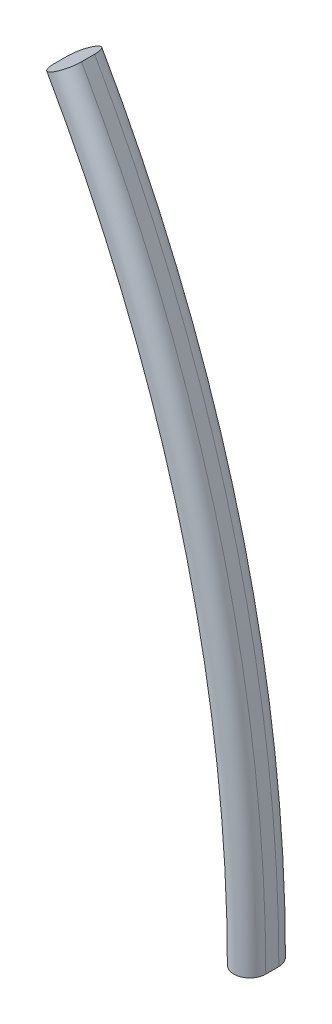
ISO-10303-21;
HEADER;
FILE_DESCRIPTION(('STEP AP214'),'2;1');
FILE_NAME('part.step','',(''),(''),'','','');
FILE_SCHEMA(('AUTOMOTIVE_DESIGN { 1 0 10303 214 1 1 1 1 }'));
ENDSEC;
DATA;
#1=APPLICATION_CONTEXT('core data for automotive mechanical design processes');
#2=APPLICATION_PROTOCOL_DEFINITION('international standard','automotive_design',2000,#1);
#3=PRODUCT_CONTEXT('',#1,'mechanical');
#4=PRODUCT('Part','Part','',(#3));
#5=PRODUCT_RELATED_PRODUCT_CATEGORY('part','',(#4));
#6=PRODUCT_DEFINITION_FORMATION('','',#4);
#7=PRODUCT_DEFINITION_CONTEXT('part definition',#1,'design');
#8=PRODUCT_DEFINITION('design','',#6,#7);
#9=PRODUCT_DEFINITION_SHAPE('','',#8);
#10=(LENGTH_UNIT() NAMED_UNIT(*) SI_UNIT(.MILLI.,.METRE.));
#11=(NAMED_UNIT(*) PLANE_ANGLE_UNIT() SI_UNIT($,.RADIAN.));
#12=(NAMED_UNIT(*) SI_UNIT($,.STERADIAN.) SOLID_ANGLE_UNIT());
#13=UNCERTAINTY_MEASURE_WITH_UNIT(LENGTH_MEASURE(1.E-05),#10,'distance_accuracy_value','');
#14=(GEOMETRIC_REPRESENTATION_CONTEXT(3) GLOBAL_UNCERTAINTY_ASSIGNED_CONTEXT((#13)) GLOBAL_UNIT_ASSIGNED_CONTEXT((#10,
#11,#12)) REPRESENTATION_CONTEXT('',''));
#15=CARTESIAN_POINT('',(0.,0.,0.));
#16=DIRECTION('',(0.,0.,1.));
#17=DIRECTION('',(1.,0.,0.));
#18=AXIS2_PLACEMENT_3D('',#15,#16,#17);
#19=CARTESIAN_POINT('',(0.,0.,2.1));
#20=DIRECTION('',(0.,1.,0.));
#21=DIRECTION('',(0.,0.,1.));
#22=AXIS2_PLACEMENT_3D('',#19,#20,#21);
#23=PLANE('',#22);
#24=DIRECTION('',(0.,0.,1.));
#25=VECTOR('',#24,1.);
#26=CARTESIAN_POINT('',(-4.72499999999998,0.,-2.1));
#27=LINE('',#26,#25);
#28=CARTESIAN_POINT('',(-4.72499999999998,0.,-2.1));
#29=VERTEX_POINT('',#28);
#30=CARTESIAN_POINT('',(-4.72499999999998,0.,2.1));
#31=VERTEX_POINT('',#30);
#32=EDGE_CURVE('E127',#29,#31,#27,.T.);
#33=ORIENTED_EDGE('',*,*,#32,.T.);
#34=CARTESIAN_POINT('',(0.,0.,2.1));
#35=DIRECTION('',(0.,1.,0.));
#36=DIRECTION('',(0.,0.,1.));
#37=AXIS2_PLACEMENT_3D('',#34,#35,#36);
#38=CIRCLE('',#37,4.725);
#39=CARTESIAN_POINT('',(4.72499999999998,0.,2.1));
#40=VERTEX_POINT('',#39);
#41=EDGE_CURVE('E130',#31,#40,#38,.T.);
#42=ORIENTED_EDGE('',*,*,#41,.T.);
#43=DIRECTION('',(0.,0.,1.));
#44=VECTOR('',#43,1.);
#45=CARTESIAN_POINT('',(4.72499999999998,0.,2.1));
#46=LINE('',#45,#44);
#47=CARTESIAN_POINT('',(4.72499999999998,0.,-2.1));
#48=VERTEX_POINT('',#47);
#49=EDGE_CURVE('E120',#40,#48,#46,.F.);
#50=ORIENTED_EDGE('',*,*,#49,.T.);
#51=CARTESIAN_POINT('',(0.,0.,-2.1));
#52=DIRECTION('',(0.,1.,0.));
#53=DIRECTION('',(0.,0.,1.));
#54=AXIS2_PLACEMENT_3D('',#51,#52,#53);
#55=CIRCLE('',#54,4.725);
#56=EDGE_CURVE('E131',#48,#29,#55,.T.);
#57=ORIENTED_EDGE('',*,*,#56,.T.);
#58=EDGE_LOOP('',(#33,#42,#50,#57));
#59=FACE_BOUND('',#58,.T.);
#60=CARTESIAN_POINT('',(0.,0.,2.1));
#61=DIRECTION('',(0.,1.,0.));
#62=DIRECTION('',(0.,0.,1.));
#63=AXIS2_PLACEMENT_3D('',#60,#61,#62);
#64=CIRCLE('',#63,5.125);
#65=CARTESIAN_POINT('',(-5.125,0.,2.1));
#66=VERTEX_POINT('',#65);
#67=CARTESIAN_POINT('',(5.125,0.,2.1));
#68=VERTEX_POINT('',#67);
#69=EDGE_CURVE('E139',#66,#68,#64,.T.);
#70=ORIENTED_EDGE('',*,*,#69,.F.);
#71=DIRECTION('',(0.,0.,1.));
#72=VECTOR('',#71,1.);
#73=CARTESIAN_POINT('',(-5.125,0.,2.1));
#74=LINE('',#73,#72);
#75=CARTESIAN_POINT('',(-5.125,0.,-2.1));
#76=VERTEX_POINT('',#75);
#77=EDGE_CURVE('E136',#76,#66,#74,.T.);
#78=ORIENTED_EDGE('',*,*,#77,.F.);
#79=CARTESIAN_POINT('',(0.,0.,-2.1));
#80=DIRECTION('',(0.,1.,0.));
#81=DIRECTION('',(0.,0.,1.));
#82=AXIS2_PLACEMENT_3D('',#79,#80,#81);
#83=CIRCLE('',#82,5.125);
#84=CARTESIAN_POINT('',(5.125,0.,-2.1));
#85=VERTEX_POINT('',#84);
#86=EDGE_CURVE('E149',#85,#76,#83,.T.);
#87=ORIENTED_EDGE('',*,*,#86,.F.);
#88=DIRECTION('',(0.,0.,-1.));
#89=VECTOR('',#88,1.);
#90=CARTESIAN_POINT('',(5.125,0.,2.1));
#91=LINE('',#90,#89);
#92=EDGE_CURVE('E152',#68,#85,#91,.T.);
#93=ORIENTED_EDGE('',*,*,#92,.F.);
#94=EDGE_LOOP('',(#70,#78,#87,#93));
#95=FACE_BOUND('',#94,.T.);
#96=ADVANCED_FACE('F38',(#59,#95),#23,.F.);
#97=CARTESIAN_POINT('',(-58.5940933456299,222.039222292077,2.1));
#98=DIRECTION('',(-0.493420493982394,0.869790903676378,0.));
#99=DIRECTION('',(0.,0.,1.));
#100=AXIS2_PLACEMENT_3D('',#97,#98,#99);
#101=PLANE('',#100);
#102=CARTESIAN_POINT('',(-58.5940933456299,222.039222292077,2.1));
#103=DIRECTION('',(-0.493420493982394,0.869790903676378,0.));
#104=DIRECTION('',(0.,0.,1.));
#105=AXIS2_PLACEMENT_3D('',#102,#103,#104);
#106=CIRCLE('',#105,5.125);
#107=CARTESIAN_POINT('',(-63.0517717269713,219.510442260417,2.1));
#108=VERTEX_POINT('',#107);
#109=CARTESIAN_POINT('',(-54.1364149642884,224.568002323737,2.1));
#110=VERTEX_POINT('',#109);
#111=EDGE_CURVE('E146',#108,#110,#106,.T.);
#112=ORIENTED_EDGE('',*,*,#111,.T.);
#113=DIRECTION('',(0.,0.,-1.));
#114=VECTOR('',#113,1.);
#115=CARTESIAN_POINT('',(-54.1364149642884,224.568002323737,2.1));
#116=LINE('',#115,#114);
#117=CARTESIAN_POINT('',(-54.1364149642884,224.568002323737,-2.1));
#118=VERTEX_POINT('',#117);
#119=EDGE_CURVE('E59',#110,#118,#116,.T.);
#120=ORIENTED_EDGE('',*,*,#119,.T.);
#121=CARTESIAN_POINT('',(-58.5940933456299,222.039222292077,-2.1));
#122=DIRECTION('',(-0.493420493982394,0.869790903676378,0.));
#123=DIRECTION('',(0.,0.,1.));
#124=AXIS2_PLACEMENT_3D('',#121,#122,#123);
#125=CIRCLE('',#124,5.125);
#126=CARTESIAN_POINT('',(-63.0517717269713,219.510442260417,-2.1));
#127=VERTEX_POINT('',#126);
#128=EDGE_CURVE('E11',#118,#127,#125,.T.);
#129=ORIENTED_EDGE('',*,*,#128,.T.);
#130=DIRECTION('',(0.,0.,1.));
#131=VECTOR('',#130,1.);
#132=CARTESIAN_POINT('',(-63.0517717269713,219.510442260417,2.1));
#133=LINE('',#132,#131);
#134=EDGE_CURVE('E140',#127,#108,#133,.T.);
#135=ORIENTED_EDGE('',*,*,#134,.T.);
#136=EDGE_LOOP('',(#112,#120,#129,#135));
#137=FACE_BOUND('',#136,.T.);
#138=ADVANCED_FACE('F172',(#137),#101,.T.);
#139=CARTESIAN_POINT('',(-450.,0.,0.));
#140=DIRECTION('',(0.,0.,1.));
#141=DIRECTION('',(1.,0.,0.));
#142=AXIS2_PLACEMENT_3D('',#139,#140,#141);
#143=CYLINDRICAL_SURFACE('',#142,444.875);
#144=CARTESIAN_POINT('',(-450.,0.,2.1));
#145=DIRECTION('',(0.,0.,1.));
#146=DIRECTION('',(1.,0.,0.));
#147=AXIS2_PLACEMENT_3D('',#144,#145,#146);
#148=CIRCLE('',#147,444.875);
#149=EDGE_CURVE('E142',#66,#108,#148,.T.);
#150=ORIENTED_EDGE('',*,*,#149,.T.);
#151=ORIENTED_EDGE('',*,*,#134,.F.);
#152=CARTESIAN_POINT('',(-450.,0.,-2.1));
#153=DIRECTION('',(0.,0.,1.));
#154=DIRECTION('',(1.,0.,0.));
#155=AXIS2_PLACEMENT_3D('',#152,#153,#154);
#156=CIRCLE('',#155,444.875);
#157=EDGE_CURVE('E143',#76,#127,#156,.T.);
#158=ORIENTED_EDGE('',*,*,#157,.F.);
#159=ORIENTED_EDGE('',*,*,#77,.T.);
#160=EDGE_LOOP('',(#150,#151,#158,#159));
#161=FACE_BOUND('',#160,.T.);
#162=ADVANCED_FACE('F169',(#161),#143,.F.);
#163=CARTESIAN_POINT('',(-450.,0.,2.1));
#164=DIRECTION('',(0.,0.,1.));
#165=DIRECTION('',(1.,0.,0.));
#166=AXIS2_PLACEMENT_3D('',#163,#164,#165);
#167=TOROIDAL_SURFACE('',#166,450.,5.125);
#168=CARTESIAN_POINT('',(-450.,0.,2.1));
#169=DIRECTION('',(0.,0.,1.));
#170=DIRECTION('',(1.,0.,0.));
#171=AXIS2_PLACEMENT_3D('',#168,#169,#170);
#172=CIRCLE('',#171,455.125);
#173=EDGE_CURVE('E154',#68,#110,#172,.T.);
#174=ORIENTED_EDGE('',*,*,#173,.T.);
#175=ORIENTED_EDGE('',*,*,#111,.F.);
#176=ORIENTED_EDGE('',*,*,#149,.F.);
#177=ORIENTED_EDGE('',*,*,#69,.T.);
#178=EDGE_LOOP('',(#174,#175,#176,#177));
#179=FACE_BOUND('',#178,.T.);
#180=ADVANCED_FACE('F174',(#179),#167,.T.);
#181=CARTESIAN_POINT('',(-450.,0.,0.));
#182=DIRECTION('',(0.,0.,1.));
#183=DIRECTION('',(1.,0.,0.));
#184=AXIS2_PLACEMENT_3D('',#181,#182,#183);
#185=CYLINDRICAL_SURFACE('',#184,455.125);
#186=CARTESIAN_POINT('',(-450.,0.,-2.1));
#187=DIRECTION('',(0.,0.,1.));
#188=DIRECTION('',(1.,0.,0.));
#189=AXIS2_PLACEMENT_3D('',#186,#187,#188);
#190=CIRCLE('',#189,455.125);
#191=EDGE_CURVE('E45',#85,#118,#190,.T.);
#192=ORIENTED_EDGE('',*,*,#191,.T.);
#193=ORIENTED_EDGE('',*,*,#119,.F.);
#194=ORIENTED_EDGE('',*,*,#173,.F.);
#195=ORIENTED_EDGE('',*,*,#92,.T.);
#196=EDGE_LOOP('',(#192,#193,#194,#195));
#197=FACE_BOUND('',#196,.T.);
#198=ADVANCED_FACE('F177',(#197),#185,.T.);
#199=CARTESIAN_POINT('',(-450.,0.,-2.1));
#200=DIRECTION('',(0.,0.,1.));
#201=DIRECTION('',(1.,0.,0.));
#202=AXIS2_PLACEMENT_3D('',#199,#200,#201);
#203=TOROIDAL_SURFACE('',#202,450.,5.125);
#204=ORIENTED_EDGE('',*,*,#128,.F.);
#205=ORIENTED_EDGE('',*,*,#191,.F.);
#206=ORIENTED_EDGE('',*,*,#86,.T.);
#207=ORIENTED_EDGE('',*,*,#157,.T.);
#208=EDGE_LOOP('',(#204,#205,#206,#207));
#209=FACE_BOUND('',#208,.T.);
#210=ADVANCED_FACE('F165',(#209),#203,.T.);
#211=CARTESIAN_POINT('',(-58.3967251480369,221.691305930607,2.1));
#212=DIRECTION('',(-0.493420493982394,0.869790903676378,0.));
#213=DIRECTION('',(0.,0.,1.));
#214=AXIS2_PLACEMENT_3D('',#211,#212,#213);
#215=PLANE('',#214);
#216=CARTESIAN_POINT('',(-62.5066434382717,219.359805446498,2.1));
#217=CARTESIAN_POINT('',(-62.5066558663638,219.359798396211,2.23289206013672));
#218=CARTESIAN_POINT('',(-62.5017675236547,219.362571486231,2.3657820662183));
#219=CARTESIAN_POINT('',(-62.4822790601644,219.373627025259,2.63061134312865));
#220=CARTESIAN_POINT('',(-62.4676794043948,219.381909210474,2.76255065917402));
#221=CARTESIAN_POINT('',(-62.4288717020881,219.403924289686,3.02445278419804));
#222=CARTESIAN_POINT('',(-62.4046704144918,219.417653349429,3.15441691690252));
#223=CARTESIAN_POINT('',(-62.3468355160003,219.450462297031,3.41153899355142));
#224=CARTESIAN_POINT('',(-62.3132020197227,219.469542119868,3.53869697157516));
#225=CARTESIAN_POINT('',(-62.2367295201972,219.512923923854,3.78934079437768));
#226=CARTESIAN_POINT('',(-62.1938878841157,219.537227398573,3.91282557737991));
#227=CARTESIAN_POINT('',(-62.0992920863532,219.590890301994,4.15525210440659));
#228=CARTESIAN_POINT('',(-62.0475346376817,219.620251595361,4.27419215309533));
#229=CARTESIAN_POINT('',(-61.9355179847312,219.683797111875,4.5065690632097));
#230=CARTESIAN_POINT('',(-61.8752636071838,219.717978596883,4.62000900018038));
#231=CARTESIAN_POINT('',(-61.7466353840625,219.790947630158,4.84069244816068));
#232=CARTESIAN_POINT('',(-61.6782585499948,219.829736873756,4.94793365676527));
#233=CARTESIAN_POINT('',(-61.5339144844954,219.911621289656,5.15537566087901));
#234=CARTESIAN_POINT('',(-61.457949893369,219.954714964147,5.25557888486101));
#235=CARTESIAN_POINT('',(-61.2989208987397,220.044929939673,5.44830943977928));
#236=CARTESIAN_POINT('',(-61.2158538838655,220.092052722102,5.54083392259445));
#237=CARTESIAN_POINT('',(-61.0432536414151,220.189966481066,5.71748854423249));
#238=CARTESIAN_POINT('',(-60.9537218185476,220.240756660728,5.80162049722461));
#239=CARTESIAN_POINT('',(-60.7687782274667,220.345672632698,5.96094433490625));
#240=CARTESIAN_POINT('',(-60.6733643000316,220.399799649903,6.03613290660307));
#241=CARTESIAN_POINT('',(-60.4774055261006,220.510964384582,6.17696992835673));
#242=CARTESIAN_POINT('',(-60.376862814404,220.568000891013,6.24262230466759));
#243=CARTESIAN_POINT('',(-60.1712870765731,220.684621197897,6.36397979749874));
#244=CARTESIAN_POINT('',(-60.0662524066841,220.744205930829,6.41968123336662));
#245=CARTESIAN_POINT('',(-59.8525197541065,220.865453543984,6.52068880180865));
#246=CARTESIAN_POINT('',(-59.7438233754475,220.927115514264,6.56599941993023));
#247=CARTESIAN_POINT('',(-59.5234600434808,221.052124621228,6.6459496639456));
#248=CARTESIAN_POINT('',(-59.4117920116926,221.115472369721,6.68058535667018));
#249=CARTESIAN_POINT('',(-59.1863410146692,221.243367639549,6.73890433516934));
#250=CARTESIAN_POINT('',(-59.0725587745766,221.307914749522,6.76259130661394));
#251=CARTESIAN_POINT('',(-58.8436674612786,221.437761663761,6.79887794712403));
#252=CARTESIAN_POINT('',(-58.728557940428,221.503061721971,6.81147375772676));
#253=CARTESIAN_POINT('',(-58.3824523588031,221.699402688902,6.83240478898302));
#254=CARTESIAN_POINT('',(-58.150442026654,221.831018979914,6.82394479936234));
#255=CARTESIAN_POINT('',(-57.8061841677641,222.026311758986,6.77784031038415));
#256=CARTESIAN_POINT('',(-57.6919987254864,222.091087600049,6.75688322502972));
#257=CARTESIAN_POINT('',(-57.4655644872472,222.219540649183,6.70399277471224));
#258=CARTESIAN_POINT('',(-57.3533150318582,222.283218231339,6.67206322790629));
#259=CARTESIAN_POINT('',(-57.1315267413363,222.40903569782,6.59743413080242));
#260=CARTESIAN_POINT('',(-57.0219888818117,222.471175028696,6.55473076428911));
#261=CARTESIAN_POINT('',(-56.8064687727878,222.593436641468,6.45888258269996));
#262=CARTESIAN_POINT('',(-56.7004852299976,222.65355965703,6.40574161483675));
#263=CARTESIAN_POINT('',(-56.4927476261841,222.771406360944,6.28936249424521));
#264=CARTESIAN_POINT('',(-56.3909952514272,222.829129092699,6.22612036355314));
#265=CARTESIAN_POINT('',(-56.1925237328493,222.94171927308,6.09002904012922));
#266=CARTESIAN_POINT('',(-56.0958027454232,222.996587767556,6.01718340139895));
#267=CARTESIAN_POINT('',(-55.9080112364702,223.103119324419,5.86235990104779));
#268=CARTESIAN_POINT('',(-55.8169425322377,223.154781355878,5.78037912578195));
#269=CARTESIAN_POINT('',(-55.6411693843315,223.254495060749,5.60791924469664));
#270=CARTESIAN_POINT('',(-55.5564626038044,223.302548059826,5.51744328706731));
#271=CARTESIAN_POINT('',(-55.3939590356954,223.394734113406,5.32858823947402));
#272=CARTESIAN_POINT('',(-55.3161638716589,223.438866246895,5.23020730290421));
#273=CARTESIAN_POINT('',(-55.168086329426,223.522868613128,5.02629793161212));
#274=CARTESIAN_POINT('',(-55.0978011900785,223.562740412234,4.92077214725286));
#275=CARTESIAN_POINT('',(-54.9651644928971,223.637983398068,4.70321551836747));
#276=CARTESIAN_POINT('',(-54.9028184246253,223.673351470641,4.59118024990265));
#277=CARTESIAN_POINT('',(-54.786581564277,223.739291053142,4.36151016483249));
#278=CARTESIAN_POINT('',(-54.7326876595116,223.769864328857,4.24387743051341));
#279=CARTESIAN_POINT('',(-54.6336619139173,223.826040281148,4.00369269124547));
#280=CARTESIAN_POINT('',(-54.5885387250618,223.851638049578,3.88113597130583));
#281=CARTESIAN_POINT('',(-54.5074569906456,223.897634609533,3.63213045993138));
#282=CARTESIAN_POINT('',(-54.4714950049258,223.918035352612,3.50568314951802));
#283=CARTESIAN_POINT('',(-54.4090041600645,223.953485554965,3.24989804632228));
#284=CARTESIAN_POINT('',(-54.3824649498203,223.968540886279,3.12056359222993));
#285=CARTESIAN_POINT('',(-54.3389628223003,223.993219048766,2.85983611706209));
#286=CARTESIAN_POINT('',(-54.3219952041528,224.002844546679,2.72844413913834));
#287=CARTESIAN_POINT('',(-54.3022834545252,224.014026752882,2.51397183878551));
#288=CARTESIAN_POINT('',(-54.2965920905307,224.017255385904,2.43123482850525));
#289=CARTESIAN_POINT('',(-54.2890111624138,224.021555942831,2.26566808319336));
#290=CARTESIAN_POINT('',(-54.2871153290598,224.022631423186,2.18283872754655));
#291=CARTESIAN_POINT('',(-54.2871161509507,224.022630956939,2.09999999999999));
#292=B_SPLINE_CURVE_WITH_KNOTS('',3,(#216,#217,#218,#219,#220,#221,#222,#223,#224,#225,#226,
#227,#228,#229,#230,#231,#232,#233,#234,#235,#236,#237,#238,#239,#240,#241,#242,#243,#244,#245,
#246,#247,#248,#249,#250,#251,#252,#253,#254,#255,#256,#257,#258,#259,#260,#261,#262,#263,#264,
#265,#266,#267,#268,#269,#270,#271,#272,#273,#274,#275,#276,#277,#278,#279,#280,#281,#282,#283,
#284,#285,#286,#287,#288,#289,#290,#291),.UNSPECIFIED.,.F.,.F.,(4,2,2,2,2,2,2,2,2,2,2,2,2,2,2,2,
2,2,2,2,2,2,2,2,2,2,2,2,2,2,2,2,2,2,2,2,2,4),(0.,0.398554494675546,0.797089906542613,
1.19534527107555,1.59359579633496,1.99196034305524,2.39047207029573,2.78875832569223,
3.18719157901532,3.58548666966944,3.98392883774071,4.38228468916018,4.78078765124225,
5.17912607328352,5.57761152899762,5.97592463982682,6.37438433389604,6.7727097965436,
7.17117377647238,7.96727314575927,8.36574241641874,8.76407316936532,9.16254521439114,
9.56087066064623,9.95935336095715,10.3576890052769,10.7561520640862,11.1544680367867,
11.5528773282683,11.9511396320733,12.3496758406059,12.7480649332965,13.1468450488956,
13.5454751955466,13.9436660743741,14.3416612200768,14.5905415212756,14.8390103965172),.UNSPECIFIED.);
#293=CARTESIAN_POINT('',(-62.5066434382717,219.359805446498,2.1));
#294=VERTEX_POINT('',#293);
#295=CARTESIAN_POINT('',(-54.2871161509507,224.022630956939,2.1));
#296=VERTEX_POINT('',#295);
#297=EDGE_CURVE('E102',#294,#296,#292,.T.);
#298=ORIENTED_EDGE('',*,*,#297,.F.);
#299=DIRECTION('',(0.,0.,1.));
#300=VECTOR('',#299,1.);
#301=CARTESIAN_POINT('',(-62.5066434382717,219.359805446498,-2.1));
#302=LINE('',#301,#300);
#303=CARTESIAN_POINT('',(-62.5066434382717,219.359805446498,-2.1));
#304=VERTEX_POINT('',#303);
#305=EDGE_CURVE('E214',#304,#294,#302,.T.);
#306=ORIENTED_EDGE('',*,*,#305,.F.);
#307=CARTESIAN_POINT('',(-54.2871161509507,224.022630956939,-2.1));
#308=CARTESIAN_POINT('',(-54.2871037228606,224.022638007224,-2.23289206150085));
#309=CARTESIAN_POINT('',(-54.2919920655871,224.019864917195,-2.36578206894781));
#310=CARTESIAN_POINT('',(-54.3114805291574,224.008809378121,-2.63061134859649));
#311=CARTESIAN_POINT('',(-54.32608018499,224.000527192871,-2.76255066601478));
#312=CARTESIAN_POINT('',(-54.3648878874941,223.978512113547,-3.02445279386408));
#313=CARTESIAN_POINT('',(-54.3890891752307,223.964783053724,-3.15441692801977));
#314=CARTESIAN_POINT('',(-54.4469240740975,223.931974105909,-3.41153900755573));
#315=CARTESIAN_POINT('',(-54.4805575706101,223.912894282939,-3.53869698701536));
#316=CARTESIAN_POINT('',(-54.5570300707389,223.869512478611,-3.78934081268629));
#317=CARTESIAN_POINT('',(-54.5998717071911,223.845209003681,-3.91282559712009));
#318=CARTESIAN_POINT('',(-54.694467505853,223.79154609975,-4.1552521269397));
#319=CARTESIAN_POINT('',(-54.7462249550533,223.762184806083,-4.27419217698976));
#320=CARTESIAN_POINT('',(-54.8582416092349,223.698639288871,-4.50656908968935));
#321=CARTESIAN_POINT('',(-54.918495987483,223.664457803465,-4.62000902788499));
#322=CARTESIAN_POINT('',(-55.0471242122066,223.591488769281,-4.84069247814926));
#323=CARTESIAN_POINT('',(-55.1155010471758,223.552699525171,-4.94793368781284));
#324=CARTESIAN_POINT('',(-55.2598451139976,223.470815108522,-5.1553756928277));
#325=CARTESIAN_POINT('',(-55.335809705472,223.427721433833,-5.25557891671877));
#326=CARTESIAN_POINT('',(-55.494838700874,223.337506457869,-5.44830947132391));
#327=CARTESIAN_POINT('',(-55.5779057161728,223.290383675199,-5.54083395391683));
#328=CARTESIAN_POINT('',(-55.7505059595437,223.192469915713,-5.71748857493491));
#329=CARTESIAN_POINT('',(-55.840037782907,223.141679735769,-5.80162052752976));
#330=CARTESIAN_POINT('',(-56.0249813750429,223.036763763201,-5.96094436421285));
#331=CARTESIAN_POINT('',(-56.1203953030375,222.982636745678,-6.03613293530835));
#332=CARTESIAN_POINT('',(-56.3163540767311,222.871472011134,-6.17696995462867));
#333=CARTESIAN_POINT('',(-56.4168967875573,222.814435505197,-6.24262232924295));
#334=CARTESIAN_POINT('',(-56.6224725235406,222.697815199361,-6.36397981873342));
#335=CARTESIAN_POINT('',(-56.7275071924524,222.638230466984,-6.41968125295726));
#336=CARTESIAN_POINT('',(-56.9412398429627,222.516982855001,-6.52068881818402));
#337=CARTESIAN_POINT('',(-57.0499362205317,222.45532088534,-6.56599943473471));
#338=CARTESIAN_POINT('',(-57.2702995502074,222.330311779675,-6.64594967571487));
#339=CARTESIAN_POINT('',(-57.3819675807946,222.266964031864,-6.68058536697517));
#340=CARTESIAN_POINT('',(-57.6074185750596,222.1390687636,-6.73890434263258));
#341=CARTESIAN_POINT('',(-57.7212008135901,222.074521654513,-6.76259131272366));
#342=CARTESIAN_POINT('',(-57.9500921236636,221.944674742103,-6.79887795077588));
#343=CARTESIAN_POINT('',(-58.0652016428518,221.879374684837,-6.81147376027436));
#344=CARTESIAN_POINT('',(-58.4113072193794,221.683033720798,-6.83240478868038));
#345=CARTESIAN_POINT('',(-58.6433175479622,221.551417431809,-6.82394479776815));
#346=CARTESIAN_POINT('',(-58.9875754028991,221.356124654979,-6.77784030788372));
#347=CARTESIAN_POINT('',(-59.1017608447565,221.291348814155,-6.75688322217588));
#348=CARTESIAN_POINT('',(-59.3281950821611,221.162895765494,-6.70399277132992));
#349=CARTESIAN_POINT('',(-59.4404445371355,221.099218183573,-6.6720632243486));
#350=CARTESIAN_POINT('',(-59.6622328268732,220.973400717537,-6.59743412709945));
#351=CARTESIAN_POINT('',(-59.7717706860277,220.911261386871,-6.55473076061559));
#352=CARTESIAN_POINT('',(-59.9872907943864,220.788999774477,-6.45888257930569));
#353=CARTESIAN_POINT('',(-60.0932743368813,220.728876759082,-6.40574161169203));
#354=CARTESIAN_POINT('',(-60.3010119417521,220.611030054568,-6.28936249095612));
#355=CARTESIAN_POINT('',(-60.4027643177983,220.553307322081,-6.22612035972103));
#356=CARTESIAN_POINT('',(-60.6012358389371,220.440717140248,-6.09002903513383));
#357=CARTESIAN_POINT('',(-60.6979568276346,220.38584864505,-6.01718339578323));
#358=CARTESIAN_POINT('',(-60.88574833911,220.279317086757,-5.86235989410428));
#359=CARTESIAN_POINT('',(-60.9768170445931,220.227655054588,-5.78037911813061));
#360=CARTESIAN_POINT('',(-61.1525901949597,220.127941348322,-5.60791923553145));
#361=CARTESIAN_POINT('',(-61.2372969766968,220.079888348558,-5.51744327709617));
#362=CARTESIAN_POINT('',(-61.3998005474713,219.987702293466,-5.32858822741447));
#363=CARTESIAN_POINT('',(-61.4775957129369,219.943570159166,-5.23020728953219));
#364=CARTESIAN_POINT('',(-61.6256732578691,219.859567791402,-5.02629791543186));
#365=CARTESIAN_POINT('',(-61.6959583984869,219.819695991575,-4.92077212957699));
#366=CARTESIAN_POINT('',(-61.8285950980034,219.744453004417,-4.7032154975132));
#367=CARTESIAN_POINT('',(-61.8909411673399,219.70908493124,-4.59118022736552));
#368=CARTESIAN_POINT('',(-62.0071780295561,219.643145347679,-4.36151013875356));
#369=CARTESIAN_POINT('',(-62.0610719351251,219.612572071508,-4.24387740257576));
#370=CARTESIAN_POINT('',(-62.1600976814816,219.556396118785,-4.003692660719));
#371=CARTESIAN_POINT('',(-62.20522087039,219.530798350324,-3.88113594010065));
#372=CARTESIAN_POINT('',(-62.2863026047427,219.484801790406,-3.63213042732287));
#373=CARTESIAN_POINT('',(-62.3222645903463,219.464401047393,-3.505683116185));
#374=CARTESIAN_POINT('',(-62.3847554347638,219.428950845291,-3.24989801153362));
#375=CARTESIAN_POINT('',(-62.4112946446823,219.413895514162,-3.12056355671066));
#376=CARTESIAN_POINT('',(-62.4547967713172,219.389217352178,-2.8598360800871));
#377=CARTESIAN_POINT('',(-62.471764388906,219.379591854582,-2.72844410143832));
#378=CARTESIAN_POINT('',(-62.4914761367986,219.368409649363,-2.51397180673328));
#379=CARTESIAN_POINT('',(-62.4971675000043,219.365181016788,-2.43123480284665));
#380=CARTESIAN_POINT('',(-62.504748427071,219.360880460457,-2.26566807035019));
#381=CARTESIAN_POINT('',(-62.5066442601625,219.35980498025,-2.18283872112509));
#382=CARTESIAN_POINT('',(-62.5066434382718,219.359805446498,-2.10000000000001));
#383=B_SPLINE_CURVE_WITH_KNOTS('',3,(#307,#308,#309,#310,#311,#312,#313,#314,#315,#316,#317,
#318,#319,#320,#321,#322,#323,#324,#325,#326,#327,#328,#329,#330,#331,#332,#333,#334,#335,#336,
#337,#338,#339,#340,#341,#342,#343,#344,#345,#346,#347,#348,#349,#350,#351,#352,#353,#354,#355,
#356,#357,#358,#359,#360,#361,#362,#363,#364,#365,#366,#367,#368,#369,#370,#371,#372,#373,#374,
#375,#376,#377,#378,#379,#380,#381,#382),.UNSPECIFIED.,.F.,.F.,(4,2,2,2,2,2,2,2,2,2,2,2,2,2,2,2,
2,2,2,2,2,2,2,2,2,2,2,2,2,2,2,2,2,2,2,2,2,4),(0.,0.398554498770298,0.797089914751015,
1.1953452836395,1.59359581325054,1.99196036442444,2.39047209612017,2.78875835589607,
3.18719161359828,3.58548670482575,3.98392887347074,4.38228472544423,4.7807876880793,
5.17912610500011,5.57761155559024,5.97592466128351,6.37438435021542,6.77270980685342,
7.17117378076953,7.96727313810831,8.36574240751261,8.76407315921339,9.16254520301942,
9.56087064806216,9.9593533530576,10.3576890020648,10.756152065577,11.1544680429765,
11.5528773406744,11.9511396506895,12.3496758654341,12.7480649643251,13.1468450818588,
13.5454752304344,13.94366611112,14.3416612586646,14.590541540551,14.8390103965334),.UNSPECIFIED.);
#384=CARTESIAN_POINT('',(-54.2871161509507,224.022630956939,-2.1));
#385=VERTEX_POINT('',#384);
#386=EDGE_CURVE('E116',#385,#304,#383,.T.);
#387=ORIENTED_EDGE('',*,*,#386,.F.);
#388=DIRECTION('',(0.,0.,1.));
#389=VECTOR('',#388,1.);
#390=CARTESIAN_POINT('',(-54.2871161509507,224.022630956939,2.1));
#391=LINE('',#390,#389);
#392=EDGE_CURVE('E114',#296,#385,#391,.F.);
#393=ORIENTED_EDGE('',*,*,#392,.F.);
#394=EDGE_LOOP('',(#298,#306,#387,#393));
#395=FACE_BOUND('',#394,.T.);
#396=ADVANCED_FACE('F115',(#395),#215,.F.);
#397=CARTESIAN_POINT('',(-450.,0.,0.));
#398=DIRECTION('',(0.,0.,1.));
#399=DIRECTION('',(1.,0.,0.));
#400=AXIS2_PLACEMENT_3D('',#397,#398,#399);
#401=CYLINDRICAL_SURFACE('',#400,445.275);
#402=CARTESIAN_POINT('',(-450.,0.,2.1));
#403=DIRECTION('',(0.,0.,1.));
#404=DIRECTION('',(1.,0.,0.));
#405=AXIS2_PLACEMENT_3D('',#402,#403,#404);
#406=CIRCLE('',#405,445.275);
#407=EDGE_CURVE('E109',#31,#294,#406,.T.);
#408=ORIENTED_EDGE('',*,*,#407,.F.);
#409=ORIENTED_EDGE('',*,*,#32,.F.);
#410=CARTESIAN_POINT('',(-450.,0.,-2.1));
#411=DIRECTION('',(0.,0.,1.));
#412=DIRECTION('',(1.,0.,0.));
#413=AXIS2_PLACEMENT_3D('',#410,#411,#412);
#414=CIRCLE('',#413,445.275);
#415=EDGE_CURVE('E124',#29,#304,#414,.T.);
#416=ORIENTED_EDGE('',*,*,#415,.T.);
#417=ORIENTED_EDGE('',*,*,#305,.T.);
#418=EDGE_LOOP('',(#408,#409,#416,#417));
#419=FACE_BOUND('',#418,.T.);
#420=ADVANCED_FACE('F193',(#419),#401,.T.);
#421=CARTESIAN_POINT('',(-450.,0.,2.1));
#422=DIRECTION('',(0.,0.,1.));
#423=DIRECTION('',(1.,0.,0.));
#424=AXIS2_PLACEMENT_3D('',#421,#422,#423);
#425=TOROIDAL_SURFACE('',#424,450.,4.725);
#426=CARTESIAN_POINT('',(-450.,0.,2.1));
#427=DIRECTION('',(0.,0.,1.));
#428=DIRECTION('',(1.,0.,0.));
#429=AXIS2_PLACEMENT_3D('',#426,#427,#428);
#430=CIRCLE('',#429,454.725);
#431=EDGE_CURVE('E106',#40,#296,#430,.T.);
#432=ORIENTED_EDGE('',*,*,#431,.F.);
#433=ORIENTED_EDGE('',*,*,#41,.F.);
#434=ORIENTED_EDGE('',*,*,#407,.T.);
#435=ORIENTED_EDGE('',*,*,#297,.T.);
#436=EDGE_LOOP('',(#432,#433,#434,#435));
#437=FACE_BOUND('',#436,.T.);
#438=ADVANCED_FACE('F104',(#437),#425,.F.);
#439=CARTESIAN_POINT('',(-450.,0.,0.));
#440=DIRECTION('',(0.,0.,1.));
#441=DIRECTION('',(1.,0.,0.));
#442=AXIS2_PLACEMENT_3D('',#439,#440,#441);
#443=CYLINDRICAL_SURFACE('',#442,454.725);
#444=CARTESIAN_POINT('',(-450.,0.,-2.1));
#445=DIRECTION('',(0.,0.,1.));
#446=DIRECTION('',(1.,0.,0.));
#447=AXIS2_PLACEMENT_3D('',#444,#445,#446);
#448=CIRCLE('',#447,454.725);
#449=EDGE_CURVE('E52',#48,#385,#448,.T.);
#450=ORIENTED_EDGE('',*,*,#449,.F.);
#451=ORIENTED_EDGE('',*,*,#49,.F.);
#452=ORIENTED_EDGE('',*,*,#431,.T.);
#453=ORIENTED_EDGE('',*,*,#392,.T.);
#454=EDGE_LOOP('',(#450,#451,#452,#453));
#455=FACE_BOUND('',#454,.T.);
#456=ADVANCED_FACE('F118',(#455),#443,.F.);
#457=CARTESIAN_POINT('',(-450.,0.,-2.1));
#458=DIRECTION('',(0.,0.,1.));
#459=DIRECTION('',(1.,0.,0.));
#460=AXIS2_PLACEMENT_3D('',#457,#458,#459);
#461=TOROIDAL_SURFACE('',#460,450.,4.725);
#462=ORIENTED_EDGE('',*,*,#386,.T.);
#463=ORIENTED_EDGE('',*,*,#415,.F.);
#464=ORIENTED_EDGE('',*,*,#56,.F.);
#465=ORIENTED_EDGE('',*,*,#449,.T.);
#466=EDGE_LOOP('',(#462,#463,#464,#465));
#467=FACE_BOUND('',#466,.T.);
#468=ADVANCED_FACE('F180',(#467),#461,.F.);
#469=CLOSED_SHELL('',(#96,#138,#162,#180,#198,#210,#396,#420,#438,#456,#468));
#470=MANIFOLD_SOLID_BREP('B2',#469);
#471=ADVANCED_BREP_SHAPE_REPRESENTATION('',(#18,#470),#14);
#472=SHAPE_DEFINITION_REPRESENTATION(#9,#471);
ENDSEC;
END-ISO-10303-21;
